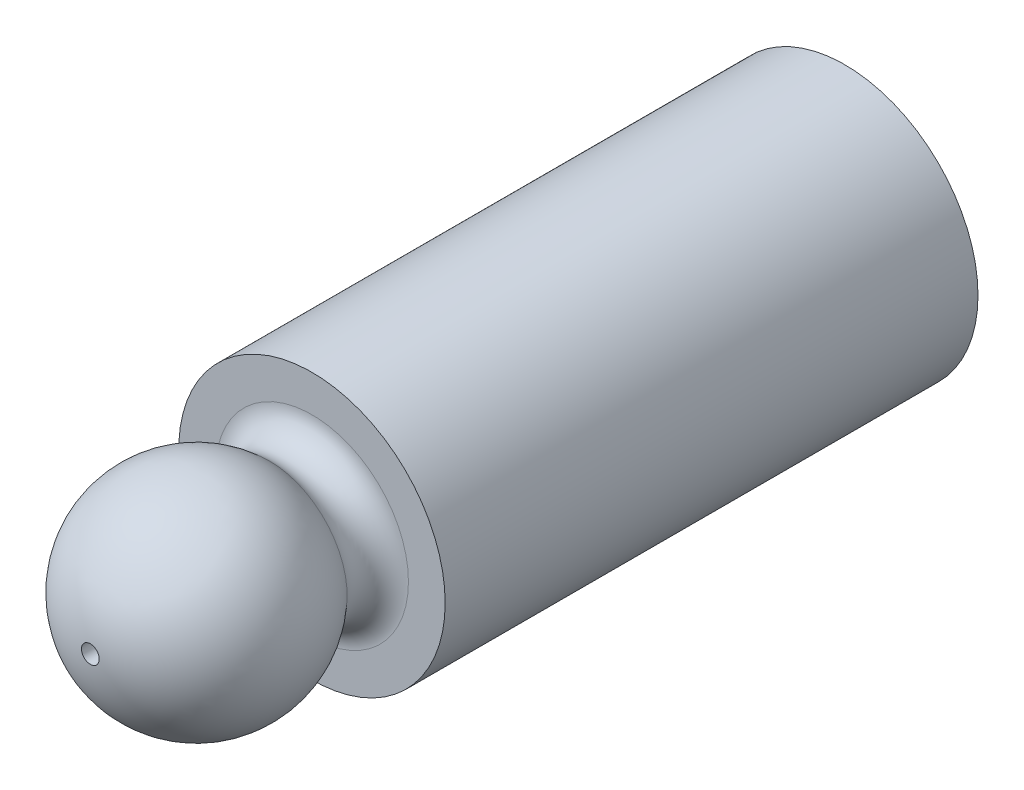
ISO-10303-21;
HEADER;
FILE_DESCRIPTION(('STEP AP214'),'2;1');
FILE_NAME('part.step','',(''),(''),'','','');
FILE_SCHEMA(('AUTOMOTIVE_DESIGN { 1 0 10303 214 1 1 1 1 }'));
ENDSEC;
DATA;
#1=APPLICATION_CONTEXT('core data for automotive mechanical design processes');
#2=APPLICATION_PROTOCOL_DEFINITION('international standard','automotive_design',2000,#1);
#3=PRODUCT_CONTEXT('',#1,'mechanical');
#4=PRODUCT('Part','Part','',(#3));
#5=PRODUCT_RELATED_PRODUCT_CATEGORY('part','',(#4));
#6=PRODUCT_DEFINITION_FORMATION('','',#4);
#7=PRODUCT_DEFINITION_CONTEXT('part definition',#1,'design');
#8=PRODUCT_DEFINITION('design','',#6,#7);
#9=PRODUCT_DEFINITION_SHAPE('','',#8);
#10=(LENGTH_UNIT() NAMED_UNIT(*) SI_UNIT(.MILLI.,.METRE.));
#11=(NAMED_UNIT(*) PLANE_ANGLE_UNIT() SI_UNIT($,.RADIAN.));
#12=(NAMED_UNIT(*) SI_UNIT($,.STERADIAN.) SOLID_ANGLE_UNIT());
#13=UNCERTAINTY_MEASURE_WITH_UNIT(LENGTH_MEASURE(1.E-05),#10,'distance_accuracy_value','');
#14=(GEOMETRIC_REPRESENTATION_CONTEXT(3) GLOBAL_UNCERTAINTY_ASSIGNED_CONTEXT((#13)) GLOBAL_UNIT_ASSIGNED_CONTEXT((#10,
#11,#12)) REPRESENTATION_CONTEXT('',''));
#15=CARTESIAN_POINT('',(0.,0.,0.));
#16=DIRECTION('',(0.,0.,1.));
#17=DIRECTION('',(1.,0.,0.));
#18=AXIS2_PLACEMENT_3D('',#15,#16,#17);
#19=CARTESIAN_POINT('',(0.,0.,30.));
#20=DIRECTION('',(0.,0.,-1.));
#21=DIRECTION('',(-1.,0.,0.));
#22=AXIS2_PLACEMENT_3D('',#19,#20,#21);
#23=CYLINDRICAL_SURFACE('',#22,7.5);
#24=CARTESIAN_POINT('',(0.,0.,30.));
#25=DIRECTION('',(0.,0.,1.));
#26=DIRECTION('',(1.,0.,0.));
#27=AXIS2_PLACEMENT_3D('',#24,#25,#26);
#28=CIRCLE('',#27,7.5);
#29=CARTESIAN_POINT('',(7.5,0.,30.));
#30=VERTEX_POINT('',#29);
#31=EDGE_CURVE('E51',#30,#30,#28,.T.);
#32=ORIENTED_EDGE('',*,*,#31,.F.);
#33=EDGE_LOOP('',(#32));
#34=FACE_BOUND('',#33,.T.);
#35=CARTESIAN_POINT('',(0.,0.,0.));
#36=DIRECTION('',(0.,0.,1.));
#37=DIRECTION('',(1.,0.,0.));
#38=AXIS2_PLACEMENT_3D('',#35,#36,#37);
#39=CIRCLE('',#38,7.5);
#40=CARTESIAN_POINT('',(7.5,0.,0.));
#41=VERTEX_POINT('',#40);
#42=EDGE_CURVE('E57',#41,#41,#39,.T.);
#43=ORIENTED_EDGE('',*,*,#42,.T.);
#44=EDGE_LOOP('',(#43));
#45=FACE_BOUND('',#44,.T.);
#46=ADVANCED_FACE('F43',(#34,#45),#23,.T.);
#47=CARTESIAN_POINT('',(0.,0.,30.));
#48=DIRECTION('',(0.,0.,1.));
#49=DIRECTION('',(1.,0.,0.));
#50=AXIS2_PLACEMENT_3D('',#47,#48,#49);
#51=PLANE('',#50);
#52=CARTESIAN_POINT('',(0.,0.,30.));
#53=DIRECTION('',(0.,0.,-1.));
#54=DIRECTION('',(-1.,0.,0.));
#55=AXIS2_PLACEMENT_3D('',#52,#53,#54);
#56=CIRCLE('',#55,5.43139024560011);
#57=CARTESIAN_POINT('',(-5.43139024560011,0.,30.));
#58=VERTEX_POINT('',#57);
#59=EDGE_CURVE('E10',#58,#58,#56,.F.);
#60=ORIENTED_EDGE('',*,*,#59,.F.);
#61=EDGE_LOOP('',(#60));
#62=FACE_BOUND('',#61,.T.);
#63=ORIENTED_EDGE('',*,*,#31,.T.);
#64=EDGE_LOOP('',(#63));
#65=FACE_BOUND('',#64,.T.);
#66=ADVANCED_FACE('F97',(#62,#65),#51,.T.);
#67=CARTESIAN_POINT('',(0.,0.,0.));
#68=DIRECTION('',(0.,0.,1.));
#69=DIRECTION('',(1.,0.,0.));
#70=AXIS2_PLACEMENT_3D('',#67,#68,#69);
#71=PLANE('',#70);
#72=CARTESIAN_POINT('',(0.,0.,0.));
#73=DIRECTION('',(0.,0.,-1.));
#74=DIRECTION('',(-1.,0.,0.));
#75=AXIS2_PLACEMENT_3D('',#72,#73,#74);
#76=CIRCLE('',#75,4.99999999999999);
#77=CARTESIAN_POINT('',(-4.99999999999999,0.,0.));
#78=VERTEX_POINT('',#77);
#79=EDGE_CURVE('E63',#78,#78,#76,.T.);
#80=ORIENTED_EDGE('',*,*,#79,.F.);
#81=EDGE_LOOP('',(#80));
#82=FACE_BOUND('',#81,.T.);
#83=ORIENTED_EDGE('',*,*,#42,.F.);
#84=EDGE_LOOP('',(#83));
#85=FACE_BOUND('',#84,.T.);
#86=ADVANCED_FACE('F94',(#82,#85),#71,.F.);
#87=CARTESIAN_POINT('',(0.,0.,31.43));
#88=DIRECTION('',(0.,0.,-1.));
#89=DIRECTION('',(-1.,0.,0.));
#90=AXIS2_PLACEMENT_3D('',#87,#88,#89);
#91=TOROIDAL_SURFACE('',#90,5.43139024560011,1.43);
#92=CARTESIAN_POINT('',(0.,0.,32.4057873485868));
#93=DIRECTION('',(0.,0.,-1.));
#94=DIRECTION('',(-1.,0.,0.));
#95=AXIS2_PLACEMENT_3D('',#92,#93,#94);
#96=CIRCLE('',#95,4.38604865055191);
#97=CARTESIAN_POINT('',(0.,4.38604865055191,32.4057873485868));
#98=VERTEX_POINT('',#97);
#99=EDGE_CURVE('E84',#98,#98,#96,.T.);
#100=ORIENTED_EDGE('',*,*,#99,.T.);
#101=EDGE_LOOP('',(#100));
#102=FACE_BOUND('',#101,.T.);
#103=ORIENTED_EDGE('',*,*,#59,.T.);
#104=EDGE_LOOP('',(#103));
#105=FACE_BOUND('',#104,.T.);
#106=ADVANCED_FACE('F96',(#102,#105),#91,.F.);
#107=CARTESIAN_POINT('',(0.,0.,36.5));
#108=DIRECTION('',(0.,0.,-1.));
#109=DIRECTION('',(0.,1.,0.));
#110=AXIS2_PLACEMENT_3D('',#107,#108,#109);
#111=SPHERICAL_SURFACE('',#110,6.00000000000001);
#112=CARTESIAN_POINT('',(0.,0.,42.4791303715507));
#113=DIRECTION('',(0.,0.,-1.));
#114=DIRECTION('',(-1.,0.,0.));
#115=AXIS2_PLACEMENT_3D('',#112,#113,#114);
#116=CIRCLE('',#115,0.5);
#117=CARTESIAN_POINT('',(0.,0.499999999999945,42.4791303715507));
#118=VERTEX_POINT('',#117);
#119=EDGE_CURVE('E73',#118,#118,#116,.F.);
#120=CARTESIAN_POINT('',(0.,0.499999999999945,42.4791303715507));
#121=CARTESIAN_POINT('',(0.,0.63941246855071,42.4674807214065));
#122=CARTESIAN_POINT('',(0.,0.778414758580845,42.4509385385535));
#123=CARTESIAN_POINT('',(0.,1.05492490639849,42.4081873007659));
#124=CARTESIAN_POINT('',(0.,1.19243276418601,42.3819782458312));
#125=CARTESIAN_POINT('',(0.,1.46527997231705,42.3200114572163));
#126=CARTESIAN_POINT('',(0.,1.60061932266058,42.284253723536));
#127=CARTESIAN_POINT('',(0.,1.86846800500517,42.2033671403779));
#128=CARTESIAN_POINT('',(0.,2.00097733700623,42.1582382909001));
#129=CARTESIAN_POINT('',(0.,2.26251778820302,42.0588294773412));
#130=CARTESIAN_POINT('',(0.,2.39154890739875,42.00454951326));
#131=CARTESIAN_POINT('',(0.,2.64550189055765,41.8871041379909));
#132=CARTESIAN_POINT('',(0.,2.77042375452081,41.8239387268028));
#133=CARTESIAN_POINT('',(0.,3.01554724487108,41.6890313385115));
#134=CARTESIAN_POINT('',(0.,3.13574887125819,41.6172893614083));
#135=CARTESIAN_POINT('',(0.,3.37084400019292,41.465579734498));
#136=CARTESIAN_POINT('',(0.,3.48573750274053,41.3856120846909));
#137=CARTESIAN_POINT('',(0.,3.70965445627727,41.2178422186367));
#138=CARTESIAN_POINT('',(0.,3.81867790726641,41.1300400023894));
#139=CARTESIAN_POINT('',(0.,4.03032154024698,40.9470304321139));
#140=CARTESIAN_POINT('',(0.,4.13294172223843,40.8518230780856));
#141=CARTESIAN_POINT('',(0.,4.33127691703291,40.6544688770857));
#142=CARTESIAN_POINT('',(0.,4.42699192983595,40.5523220301141));
#143=CARTESIAN_POINT('',(0.,4.61104865827732,40.3415884284367));
#144=CARTESIAN_POINT('',(0.,4.69939037391564,40.2330016737309));
#145=CARTESIAN_POINT('',(0.,4.86826844174447,40.0099193383416));
#146=CARTESIAN_POINT('',(0.,4.94880479393497,39.895423757658));
#147=CARTESIAN_POINT('',(0.,5.10167824346831,39.6610837512883));
#148=CARTESIAN_POINT('',(0.,5.17401534081114,39.5412393256023));
#149=CARTESIAN_POINT('',(0.,5.31013649059242,39.2967877706073));
#150=CARTESIAN_POINT('',(0.,5.37392054303087,39.1721806412985));
#151=CARTESIAN_POINT('',(0.,5.49262364462602,38.9188131141191));
#152=CARTESIAN_POINT('',(0.,5.54754269378272,38.7900527162485));
#153=CARTESIAN_POINT('',(0.,5.64824718785829,38.5290084000295));
#154=CARTESIAN_POINT('',(0.,5.69403263277715,38.396724481681));
#155=CARTESIAN_POINT('',(0.,5.77624598853009,38.1292801056079));
#156=CARTESIAN_POINT('',(0.,5.81267389936415,37.9941196478832));
#157=CARTESIAN_POINT('',(0.,5.87599402341692,37.7215832428891));
#158=CARTESIAN_POINT('',(0.,5.90288623663563,37.5842072956195));
#159=CARTESIAN_POINT('',(0.,5.94700343961679,37.3079117969977));
#160=CARTESIAN_POINT('',(0.,5.96422842937924,37.1689922456454));
#161=CARTESIAN_POINT('',(0.,5.98892694056365,36.8902889738641));
#162=CARTESIAN_POINT('',(0.,5.99640046198562,36.7505052534349));
#163=CARTESIAN_POINT('',(0.,6.00155948461485,36.4707573050136));
#164=CARTESIAN_POINT('',(0.,5.99924498582212,36.3307930770213));
#165=CARTESIAN_POINT('',(0.,5.98483928783772,36.0513686578807));
#166=CARTESIAN_POINT('',(0.,5.97274808864604,35.9119084667324));
#167=CARTESIAN_POINT('',(0.,5.93884812634142,35.6341742003024));
#168=CARTESIAN_POINT('',(0.,5.91703936322847,35.4959001250208));
#169=CARTESIAN_POINT('',(0.,5.8638109357409,35.2212143690299));
#170=CARTESIAN_POINT('',(0.,5.83239127136628,35.0848026883207));
#171=CARTESIAN_POINT('',(0.,5.76009471319901,34.8145088884968));
#172=CARTESIAN_POINT('',(0.,5.71921781940637,34.6806267693821));
#173=CARTESIAN_POINT('',(0.,5.62820671440286,34.4160468992046));
#174=CARTESIAN_POINT('',(0.,5.578072503192,34.2853491481419));
#175=CARTESIAN_POINT('',(0.,5.46879200286107,34.0277772046487));
#176=CARTESIAN_POINT('',(0.,5.409645713741,33.9009030122183));
#177=CARTESIAN_POINT('',(0.,5.28263018224875,33.6515988313766));
#178=CARTESIAN_POINT('',(0.,5.21476093987657,33.5291688429653));
#179=CARTESIAN_POINT('',(0.,5.07063200424993,33.2893514001388));
#180=CARTESIAN_POINT('',(0.,4.99437231099547,33.1719639457236));
#181=CARTESIAN_POINT('',(0.,4.83383334387516,32.9428074011692));
#182=CARTESIAN_POINT('',(0.,4.74955407000931,32.8310383110301));
#183=CARTESIAN_POINT('',(0.,4.57339599370269,32.6136587758147));
#184=CARTESIAN_POINT('',(0.,4.48151719126192,32.5080483307384));
#185=CARTESIAN_POINT('',(0.,4.38604865055191,32.4057873485868));
#186=B_SPLINE_CURVE_WITH_KNOTS('',3,(#120,#121,#122,#123,#124,#125,#126,#127,#128,#129,#130,
#131,#132,#133,#134,#135,#136,#137,#138,#139,#140,#141,#142,#143,#144,#145,#146,#147,#148,#149,
#150,#151,#152,#153,#154,#155,#156,#157,#158,#159,#160,#161,#162,#163,#164,#165,#166,#167,#168,
#169,#170,#171,#172,#173,#174,#175,#176,#177,#178,#179,#180,#181,#182,#183,#184,#185),
.UNSPECIFIED.,.F.,.F.,(4,2,2,2,2,2,2,2,2,2,2,2,2,2,2,2,2,2,2,2,2,2,2,2,2,2,2,2,2,2,2,2,4),(0.,
0.419607771131542,0.839215542263086,1.25882331339463,1.67843108452617,2.09803885565771,
2.51764662678926,2.9372543979208,3.35686216905234,3.77646994018388,4.19607771131543,
4.61568548244697,5.03529325357852,5.45490102471006,5.8745087958416,6.29411656697315,
6.71372433810469,7.13333210923623,7.55293988036777,7.97254765149931,8.39215542263086,
8.8117631937624,9.23137096489395,9.65097873602549,10.070586507157,10.4901942782886,
10.9098020494201,11.3294098205517,11.7490175916832,12.1686253628147,12.5882331339463,
13.0078409050778,13.4274486762094),.UNSPECIFIED.);
#187=EDGE_CURVE('BSEAM103',#118,#98,#186,.T.);
#188=ORIENTED_EDGE('',*,*,#119,.F.);
#189=ORIENTED_EDGE('',*,*,#99,.F.);
#190=ORIENTED_EDGE('',*,*,#187,.T.);
#191=ORIENTED_EDGE('',*,*,#187,.F.);
#192=EDGE_LOOP('',(#188,#190,#189,#191));
#193=FACE_BOUND('',#192,.T.);
#194=ADVANCED_FACE('F103',(#193),#111,.T.);
#195=CARTESIAN_POINT('',(0.,0.,25.));
#196=DIRECTION('',(0.,0.,-1.));
#197=DIRECTION('',(-1.,0.,0.));
#198=AXIS2_PLACEMENT_3D('',#195,#196,#197);
#199=CONICAL_SURFACE('',#198,5.,1.02974425867665);
#200=CARTESIAN_POINT('',(0.,0.,27.4034424761103));
#201=DIRECTION('',(0.,0.,-1.));
#202=DIRECTION('',(-1.,0.,0.));
#203=AXIS2_PLACEMENT_3D('',#200,#201,#202);
#204=CIRCLE('',#203,0.99999999999999);
#205=CARTESIAN_POINT('',(-0.99999999999999,0.,27.4034424761103));
#206=VERTEX_POINT('',#205);
#207=EDGE_CURVE('E60',#206,#206,#204,.F.);
#208=CARTESIAN_POINT('',(0.,0.,25.));
#209=DIRECTION('',(0.,0.,-1.));
#210=DIRECTION('',(-1.,0.,0.));
#211=AXIS2_PLACEMENT_3D('',#208,#209,#210);
#212=CIRCLE('',#211,5.);
#213=CARTESIAN_POINT('',(-4.99999999999999,0.,25.));
#214=VERTEX_POINT('',#213);
#215=EDGE_CURVE('E70',#214,#214,#212,.T.);
#216=CARTESIAN_POINT('',(-0.99999999999999,0.,27.4034424761103));
#217=CARTESIAN_POINT('',(-1.04166666666666,0.,27.3784066169841));
#218=CARTESIAN_POINT('',(-1.08333333333332,0.,27.353370757858));
#219=CARTESIAN_POINT('',(-1.16666666666666,0.,27.3032990396057));
#220=CARTESIAN_POINT('',(-1.20833333333332,0.,27.2782631804795));
#221=CARTESIAN_POINT('',(-1.29166666666666,0.,27.2281914622272));
#222=CARTESIAN_POINT('',(-1.33333333333332,0.,27.2031556031011));
#223=CARTESIAN_POINT('',(-1.41666666666666,0.,27.1530838848488));
#224=CARTESIAN_POINT('',(-1.45833333333332,0.,27.1280480257226));
#225=CARTESIAN_POINT('',(-1.54166666666666,0.,27.0779763074703));
#226=CARTESIAN_POINT('',(-1.58333333333332,0.,27.0529404483442));
#227=CARTESIAN_POINT('',(-1.66666666666666,0.,27.0028687300919));
#228=CARTESIAN_POINT('',(-1.70833333333332,0.,26.9778328709657));
#229=CARTESIAN_POINT('',(-1.79166666666666,0.,26.9277611527134));
#230=CARTESIAN_POINT('',(-1.83333333333332,0.,26.9027252935873));
#231=CARTESIAN_POINT('',(-1.91666666666666,0.,26.852653575335));
#232=CARTESIAN_POINT('',(-1.95833333333332,0.,26.8276177162088));
#233=CARTESIAN_POINT('',(-2.04166666666666,0.,26.7775459979565));
#234=CARTESIAN_POINT('',(-2.08333333333332,0.,26.7525101388304));
#235=CARTESIAN_POINT('',(-2.16666666666666,0.,26.7024384205781));
#236=CARTESIAN_POINT('',(-2.20833333333332,0.,26.6774025614519));
#237=CARTESIAN_POINT('',(-2.29166666666666,0.,26.6273308431997));
#238=CARTESIAN_POINT('',(-2.33333333333332,0.,26.6022949840735));
#239=CARTESIAN_POINT('',(-2.41666666666666,0.,26.5522232658212));
#240=CARTESIAN_POINT('',(-2.45833333333332,0.,26.5271874066951));
#241=CARTESIAN_POINT('',(-2.54166666666666,0.,26.4771156884428));
#242=CARTESIAN_POINT('',(-2.58333333333332,0.,26.4520798293166));
#243=CARTESIAN_POINT('',(-2.66666666666666,0.,26.4020081110643));
#244=CARTESIAN_POINT('',(-2.70833333333332,0.,26.3769722519382));
#245=CARTESIAN_POINT('',(-2.79166666666666,0.,26.3269005336859));
#246=CARTESIAN_POINT('',(-2.83333333333333,0.,26.3018646745597));
#247=CARTESIAN_POINT('',(-2.91666666666666,0.,26.2517929563074));
#248=CARTESIAN_POINT('',(-2.95833333333333,0.,26.2267570971813));
#249=CARTESIAN_POINT('',(-3.04166666666666,0.,26.176685378929));
#250=CARTESIAN_POINT('',(-3.08333333333333,0.,26.1516495198028));
#251=CARTESIAN_POINT('',(-3.16666666666666,0.,26.1015778015505));
#252=CARTESIAN_POINT('',(-3.20833333333333,0.,26.0765419424244));
#253=CARTESIAN_POINT('',(-3.29166666666666,0.,26.0264702241721));
#254=CARTESIAN_POINT('',(-3.33333333333333,0.,26.0014343650459));
#255=CARTESIAN_POINT('',(-3.41666666666666,0.,25.9513626467936));
#256=CARTESIAN_POINT('',(-3.45833333333333,0.,25.9263267876675));
#257=CARTESIAN_POINT('',(-3.54166666666666,0.,25.8762550694152));
#258=CARTESIAN_POINT('',(-3.58333333333333,0.,25.851219210289));
#259=CARTESIAN_POINT('',(-3.66666666666666,0.,25.8011474920368));
#260=CARTESIAN_POINT('',(-3.70833333333333,0.,25.7761116329106));
#261=CARTESIAN_POINT('',(-3.79166666666666,0.,25.7260399146583));
#262=CARTESIAN_POINT('',(-3.83333333333333,0.,25.7010040555322));
#263=CARTESIAN_POINT('',(-3.91666666666666,0.,25.6509323372799));
#264=CARTESIAN_POINT('',(-3.95833333333333,0.,25.6258964781537));
#265=CARTESIAN_POINT('',(-4.04166666666666,0.,25.5758247599014));
#266=CARTESIAN_POINT('',(-4.08333333333333,0.,25.5507889007753));
#267=CARTESIAN_POINT('',(-4.16666666666666,0.,25.500717182523));
#268=CARTESIAN_POINT('',(-4.20833333333333,0.,25.4756813233968));
#269=CARTESIAN_POINT('',(-4.29166666666666,0.,25.4256096051445));
#270=CARTESIAN_POINT('',(-4.33333333333333,0.,25.4005737460184));
#271=CARTESIAN_POINT('',(-4.41666666666666,0.,25.3505020277661));
#272=CARTESIAN_POINT('',(-4.45833333333333,0.,25.3254661686399));
#273=CARTESIAN_POINT('',(-4.54166666666666,0.,25.2753944503876));
#274=CARTESIAN_POINT('',(-4.58333333333333,0.,25.2503585912615));
#275=CARTESIAN_POINT('',(-4.66666666666666,0.,25.2002868730092));
#276=CARTESIAN_POINT('',(-4.70833333333333,0.,25.175251013883));
#277=CARTESIAN_POINT('',(-4.79166666666666,0.,25.1251792956307));
#278=CARTESIAN_POINT('',(-4.83333333333333,0.,25.1001434365046));
#279=CARTESIAN_POINT('',(-4.91666666666666,0.,25.0500717182523));
#280=CARTESIAN_POINT('',(-4.95833333333333,0.,25.0250358591262));
#281=CARTESIAN_POINT('',(-4.99999999999999,0.,25.));
#282=B_SPLINE_CURVE_WITH_KNOTS('',3,(#216,#217,#218,#219,#220,#221,#222,#223,#224,#225,#226,
#227,#228,#229,#230,#231,#232,#233,#234,#235,#236,#237,#238,#239,#240,#241,#242,#243,#244,#245,
#246,#247,#248,#249,#250,#251,#252,#253,#254,#255,#256,#257,#258,#259,#260,#261,#262,#263,#264,
#265,#266,#267,#268,#269,#270,#271,#272,#273,#274,#275,#276,#277,#278,#279,#280,#281),
.UNSPECIFIED.,.F.,.F.,(4,2,2,2,2,2,2,2,2,2,2,2,2,2,2,2,2,2,2,2,2,2,2,2,2,2,2,2,2,2,2,2,4),(0.,
0.145829174651919,0.291658349303835,0.437487523955751,0.583316698607667,0.729145873259584,
0.8749750479115,1.02080422256342,1.16663339721533,1.31246257186725,1.45829174651917,
1.60412092117108,1.749950095823,1.89577927047492,2.04160844512683,2.18743761977875,
2.33326679443067,2.47909596908258,2.6249251437345,2.77075431838641,2.91658349303833,
3.06241266769025,3.20824184234217,3.35407101699408,3.499900191646,3.64572936629791,
3.79155854094983,3.93738771560175,4.08321689025366,4.22904606490558,4.3748752395575,
4.52070441420941,4.66653358886133),.UNSPECIFIED.);
#283=EDGE_CURVE('BSEAM138',#206,#214,#282,.T.);
#284=ORIENTED_EDGE('',*,*,#207,.T.);
#285=ORIENTED_EDGE('',*,*,#215,.T.);
#286=ORIENTED_EDGE('',*,*,#283,.T.);
#287=ORIENTED_EDGE('',*,*,#283,.F.);
#288=EDGE_LOOP('',(#284,#286,#285,#287));
#289=FACE_BOUND('',#288,.T.);
#290=ADVANCED_FACE('F138',(#289),#199,.F.);
#291=CARTESIAN_POINT('',(0.,0.,0.));
#292=DIRECTION('',(0.,0.,-1.));
#293=DIRECTION('',(-1.,0.,0.));
#294=AXIS2_PLACEMENT_3D('',#291,#292,#293);
#295=CYLINDRICAL_SURFACE('',#294,4.99999999999999);
#296=ORIENTED_EDGE('',*,*,#215,.F.);
#297=EDGE_LOOP('',(#296));
#298=FACE_BOUND('',#297,.T.);
#299=ORIENTED_EDGE('',*,*,#79,.T.);
#300=EDGE_LOOP('',(#299));
#301=FACE_BOUND('',#300,.T.);
#302=ADVANCED_FACE('F150',(#298,#301),#295,.F.);
#303=CARTESIAN_POINT('',(0.,0.,0.));
#304=DIRECTION('',(0.,0.,-1.));
#305=DIRECTION('',(-1.,0.,0.));
#306=AXIS2_PLACEMENT_3D('',#303,#304,#305);
#307=CYLINDRICAL_SURFACE('',#306,0.99999999999999);
#308=CARTESIAN_POINT('',(0.,0.,37.));
#309=DIRECTION('',(0.,0.,-1.));
#310=DIRECTION('',(-1.,0.,0.));
#311=AXIS2_PLACEMENT_3D('',#308,#309,#310);
#312=CIRCLE('',#311,0.999999999999992);
#313=CARTESIAN_POINT('',(-0.999999999999992,0.,37.));
#314=VERTEX_POINT('',#313);
#315=EDGE_CURVE('E64',#314,#314,#312,.T.);
#316=ORIENTED_EDGE('',*,*,#315,.F.);
#317=EDGE_LOOP('',(#316));
#318=FACE_BOUND('',#317,.T.);
#319=ORIENTED_EDGE('',*,*,#207,.F.);
#320=EDGE_LOOP('',(#319));
#321=FACE_BOUND('',#320,.T.);
#322=ADVANCED_FACE('F158',(#318,#321),#307,.F.);
#323=CARTESIAN_POINT('',(0.,0.,37.));
#324=DIRECTION('',(0.,0.,-1.));
#325=DIRECTION('',(-1.,0.,0.));
#326=AXIS2_PLACEMENT_3D('',#323,#324,#325);
#327=CONICAL_SURFACE('',#326,0.999999999999992,1.02974425867665);
#328=CARTESIAN_POINT('',(0.,0.,37.3004303095138));
#329=DIRECTION('',(0.,0.,-1.));
#330=DIRECTION('',(-1.,0.,0.));
#331=AXIS2_PLACEMENT_3D('',#328,#329,#330);
#332=CIRCLE('',#331,0.5);
#333=CARTESIAN_POINT('',(-0.5,0.,37.3004303095138));
#334=VERTEX_POINT('',#333);
#335=EDGE_CURVE('E46',#334,#334,#332,.F.);
#336=ORIENTED_EDGE('',*,*,#335,.T.);
#337=EDGE_LOOP('',(#336));
#338=FACE_BOUND('',#337,.T.);
#339=ORIENTED_EDGE('',*,*,#315,.T.);
#340=EDGE_LOOP('',(#339));
#341=FACE_BOUND('',#340,.T.);
#342=ADVANCED_FACE('F167',(#338,#341),#327,.F.);
#343=CARTESIAN_POINT('',(0.,0.,42.5));
#344=DIRECTION('',(0.,0.,-1.));
#345=DIRECTION('',(-1.,0.,0.));
#346=AXIS2_PLACEMENT_3D('',#343,#344,#345);
#347=CYLINDRICAL_SURFACE('',#346,0.5);
#348=ORIENTED_EDGE('',*,*,#119,.T.);
#349=EDGE_LOOP('',(#348));
#350=FACE_BOUND('',#349,.T.);
#351=ORIENTED_EDGE('',*,*,#335,.F.);
#352=EDGE_LOOP('',(#351));
#353=FACE_BOUND('',#352,.T.);
#354=ADVANCED_FACE('F176',(#350,#353),#347,.F.);
#355=CLOSED_SHELL('',(#46,#66,#86,#106,#194,#290,#302,#322,#342,#354));
#356=MANIFOLD_SOLID_BREP('B2',#355);
#357=ADVANCED_BREP_SHAPE_REPRESENTATION('',(#18,#356),#14);
#358=SHAPE_DEFINITION_REPRESENTATION(#9,#357);
ENDSEC;
END-ISO-10303-21;
